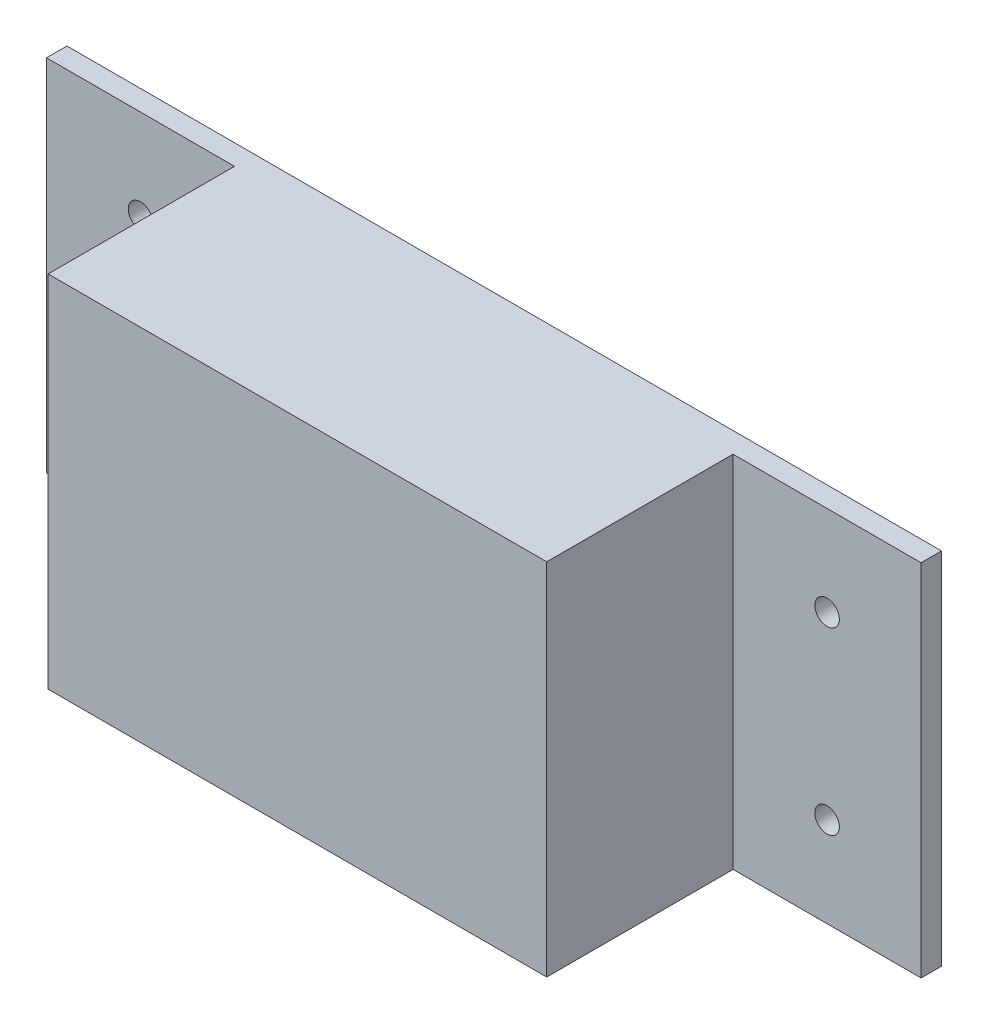
ISO-10303-21;
HEADER;
FILE_DESCRIPTION(('STEP AP214'),'2;1');
FILE_NAME('part.step','',(''),(''),'','','');
FILE_SCHEMA(('AUTOMOTIVE_DESIGN { 1 0 10303 214 1 1 1 1 }'));
ENDSEC;
DATA;
#1=APPLICATION_CONTEXT('core data for automotive mechanical design processes');
#2=APPLICATION_PROTOCOL_DEFINITION('international standard','automotive_design',2000,#1);
#3=PRODUCT_CONTEXT('',#1,'mechanical');
#4=PRODUCT('Part','Part','',(#3));
#5=PRODUCT_RELATED_PRODUCT_CATEGORY('part','',(#4));
#6=PRODUCT_DEFINITION_FORMATION('','',#4);
#7=PRODUCT_DEFINITION_CONTEXT('part definition',#1,'design');
#8=PRODUCT_DEFINITION('design','',#6,#7);
#9=PRODUCT_DEFINITION_SHAPE('','',#8);
#10=(LENGTH_UNIT() NAMED_UNIT(*) SI_UNIT(.MILLI.,.METRE.));
#11=(NAMED_UNIT(*) PLANE_ANGLE_UNIT() SI_UNIT($,.RADIAN.));
#12=(NAMED_UNIT(*) SI_UNIT($,.STERADIAN.) SOLID_ANGLE_UNIT());
#13=UNCERTAINTY_MEASURE_WITH_UNIT(LENGTH_MEASURE(1.E-05),#10,'distance_accuracy_value','');
#14=(GEOMETRIC_REPRESENTATION_CONTEXT(3) GLOBAL_UNCERTAINTY_ASSIGNED_CONTEXT((#13)) GLOBAL_UNIT_ASSIGNED_CONTEXT((#10,
#11,#12)) REPRESENTATION_CONTEXT('',''));
#15=CARTESIAN_POINT('',(0.,0.,0.));
#16=DIRECTION('',(0.,0.,1.));
#17=DIRECTION('',(1.,0.,0.));
#18=AXIS2_PLACEMENT_3D('',#15,#16,#17);
#19=CARTESIAN_POINT('',(0.,0.,0.));
#20=DIRECTION('',(0.,0.,-1.));
#21=DIRECTION('',(-1.,0.,0.));
#22=AXIS2_PLACEMENT_3D('',#19,#20,#21);
#23=PLANE('',#22);
#24=CARTESIAN_POINT('',(42.,-11.,0.));
#25=DIRECTION('',(0.,0.,-1.));
#26=DIRECTION('',(-1.,0.,0.));
#27=AXIS2_PLACEMENT_3D('',#24,#25,#26);
#28=CIRCLE('',#27,1.5);
#29=CARTESIAN_POINT('',(40.5,-11.,0.));
#30=VERTEX_POINT('',#29);
#31=EDGE_CURVE('E532',#30,#30,#28,.F.);
#32=ORIENTED_EDGE('',*,*,#31,.T.);
#33=EDGE_LOOP('',(#32));
#34=FACE_BOUND('',#33,.T.);
#35=CARTESIAN_POINT('',(-42.,11.,0.));
#36=DIRECTION('',(0.,0.,-1.));
#37=DIRECTION('',(-1.,0.,0.));
#38=AXIS2_PLACEMENT_3D('',#35,#36,#37);
#39=CIRCLE('',#38,1.5);
#40=CARTESIAN_POINT('',(-43.5,11.,0.));
#41=VERTEX_POINT('',#40);
#42=EDGE_CURVE('E544',#41,#41,#39,.F.);
#43=ORIENTED_EDGE('',*,*,#42,.T.);
#44=EDGE_LOOP('',(#43));
#45=FACE_BOUND('',#44,.T.);
#46=DIRECTION('',(0.,-1.,0.));
#47=VECTOR('',#46,1.);
#48=CARTESIAN_POINT('',(27.5,0.,0.));
#49=LINE('',#48,#47);
#50=CARTESIAN_POINT('',(27.5,19.,0.));
#51=VERTEX_POINT('',#50);
#52=CARTESIAN_POINT('',(27.5,-19.,0.));
#53=VERTEX_POINT('',#52);
#54=EDGE_CURVE('E237',#51,#53,#49,.T.);
#55=ORIENTED_EDGE('',*,*,#54,.F.);
#56=DIRECTION('',(1.,0.,0.));
#57=VECTOR('',#56,1.);
#58=CARTESIAN_POINT('',(0.,19.,0.));
#59=LINE('',#58,#57);
#60=CARTESIAN_POINT('',(-27.5,19.,0.));
#61=VERTEX_POINT('',#60);
#62=EDGE_CURVE('E256',#61,#51,#59,.T.);
#63=ORIENTED_EDGE('',*,*,#62,.F.);
#64=DIRECTION('',(0.,-1.,0.));
#65=VECTOR('',#64,1.);
#66=CARTESIAN_POINT('',(-27.5,0.,0.));
#67=LINE('',#66,#65);
#68=CARTESIAN_POINT('',(-27.5,-19.,0.));
#69=VERTEX_POINT('',#68);
#70=EDGE_CURVE('E260',#61,#69,#67,.T.);
#71=ORIENTED_EDGE('',*,*,#70,.T.);
#72=DIRECTION('',(1.,0.,0.));
#73=VECTOR('',#72,1.);
#74=CARTESIAN_POINT('',(0.,-19.,0.));
#75=LINE('',#74,#73);
#76=EDGE_CURVE('E242',#69,#53,#75,.T.);
#77=ORIENTED_EDGE('',*,*,#76,.T.);
#78=EDGE_LOOP('',(#55,#63,#71,#77));
#79=FACE_BOUND('',#78,.T.);
#80=DIRECTION('',(1.,0.,0.));
#81=VECTOR('',#80,1.);
#82=CARTESIAN_POINT('',(-30.5,22.,0.));
#83=LINE('',#82,#81);
#84=CARTESIAN_POINT('',(-53.5,22.,0.));
#85=VERTEX_POINT('',#84);
#86=CARTESIAN_POINT('',(53.5,22.,0.));
#87=VERTEX_POINT('',#86);
#88=EDGE_CURVE('E157',#85,#87,#83,.T.);
#89=ORIENTED_EDGE('',*,*,#88,.T.);
#90=DIRECTION('',(0.,1.,0.));
#91=VECTOR('',#90,1.);
#92=CARTESIAN_POINT('',(53.5,22.,0.));
#93=LINE('',#92,#91);
#94=CARTESIAN_POINT('',(53.5,-22.,0.));
#95=VERTEX_POINT('',#94);
#96=EDGE_CURVE('E161',#95,#87,#93,.T.);
#97=ORIENTED_EDGE('',*,*,#96,.F.);
#98=DIRECTION('',(1.,0.,0.));
#99=VECTOR('',#98,1.);
#100=CARTESIAN_POINT('',(-30.5,-22.,0.));
#101=LINE('',#100,#99);
#102=CARTESIAN_POINT('',(-53.5,-22.,0.));
#103=VERTEX_POINT('',#102);
#104=EDGE_CURVE('E168',#103,#95,#101,.T.);
#105=ORIENTED_EDGE('',*,*,#104,.F.);
#106=DIRECTION('',(0.,-1.,0.));
#107=VECTOR('',#106,1.);
#108=CARTESIAN_POINT('',(-53.5,22.,0.));
#109=LINE('',#108,#107);
#110=EDGE_CURVE('E163',#85,#103,#109,.T.);
#111=ORIENTED_EDGE('',*,*,#110,.F.);
#112=EDGE_LOOP('',(#89,#97,#105,#111));
#113=FACE_BOUND('',#112,.T.);
#114=CARTESIAN_POINT('',(42.,11.,0.));
#115=DIRECTION('',(0.,0.,-1.));
#116=DIRECTION('',(-1.,0.,0.));
#117=AXIS2_PLACEMENT_3D('',#114,#115,#116);
#118=CIRCLE('',#117,1.5);
#119=CARTESIAN_POINT('',(40.5,11.,0.));
#120=VERTEX_POINT('',#119);
#121=EDGE_CURVE('E541',#120,#120,#118,.T.);
#122=ORIENTED_EDGE('',*,*,#121,.F.);
#123=EDGE_LOOP('',(#122));
#124=FACE_BOUND('',#123,.T.);
#125=CARTESIAN_POINT('',(-42.,-11.,0.));
#126=DIRECTION('',(0.,0.,-1.));
#127=DIRECTION('',(-1.,0.,0.));
#128=AXIS2_PLACEMENT_3D('',#125,#126,#127);
#129=CIRCLE('',#128,1.5);
#130=CARTESIAN_POINT('',(-43.5,-11.,0.));
#131=VERTEX_POINT('',#130);
#132=EDGE_CURVE('E187',#131,#131,#129,.T.);
#133=ORIENTED_EDGE('',*,*,#132,.F.);
#134=EDGE_LOOP('',(#133));
#135=FACE_BOUND('',#134,.T.);
#136=ADVANCED_FACE('F63',(#34,#45,#79,#113,#124,#135),#23,.T.);
#137=CARTESIAN_POINT('',(-53.5,22.,2.5));
#138=DIRECTION('',(0.,0.,1.));
#139=DIRECTION('',(0.,-1.,0.));
#140=AXIS2_PLACEMENT_3D('',#137,#138,#139);
#141=PLANE('',#140);
#142=CARTESIAN_POINT('',(-42.,11.,2.5));
#143=DIRECTION('',(0.,0.,-1.));
#144=DIRECTION('',(-1.,0.,0.));
#145=AXIS2_PLACEMENT_3D('',#142,#143,#144);
#146=CIRCLE('',#145,1.5);
#147=CARTESIAN_POINT('',(-43.5,11.,2.5));
#148=VERTEX_POINT('',#147);
#149=EDGE_CURVE('E526',#148,#148,#146,.T.);
#150=ORIENTED_EDGE('',*,*,#149,.T.);
#151=EDGE_LOOP('',(#150));
#152=FACE_BOUND('',#151,.T.);
#153=DIRECTION('',(0.,-1.,0.));
#154=VECTOR('',#153,1.);
#155=CARTESIAN_POINT('',(-30.5,22.,2.5));
#156=LINE('',#155,#154);
#157=CARTESIAN_POINT('',(-30.5,22.,2.5));
#158=VERTEX_POINT('',#157);
#159=CARTESIAN_POINT('',(-30.5,-22.,2.5));
#160=VERTEX_POINT('',#159);
#161=EDGE_CURVE('E202',#158,#160,#156,.T.);
#162=ORIENTED_EDGE('',*,*,#161,.F.);
#163=DIRECTION('',(1.,0.,0.));
#164=VECTOR('',#163,1.);
#165=CARTESIAN_POINT('',(-53.5,22.,2.5));
#166=LINE('',#165,#164);
#167=CARTESIAN_POINT('',(-53.5,22.,2.5));
#168=VERTEX_POINT('',#167);
#169=EDGE_CURVE('E214',#168,#158,#166,.T.);
#170=ORIENTED_EDGE('',*,*,#169,.F.);
#171=DIRECTION('',(0.,-1.,0.));
#172=VECTOR('',#171,1.);
#173=CARTESIAN_POINT('',(-53.5,22.,2.5));
#174=LINE('',#173,#172);
#175=CARTESIAN_POINT('',(-53.5,-22.,2.5));
#176=VERTEX_POINT('',#175);
#177=EDGE_CURVE('E206',#168,#176,#174,.T.);
#178=ORIENTED_EDGE('',*,*,#177,.T.);
#179=DIRECTION('',(1.,0.,0.));
#180=VECTOR('',#179,1.);
#181=CARTESIAN_POINT('',(-53.5,-22.,2.5));
#182=LINE('',#181,#180);
#183=EDGE_CURVE('E89',#176,#160,#182,.T.);
#184=ORIENTED_EDGE('',*,*,#183,.T.);
#185=EDGE_LOOP('',(#162,#170,#178,#184));
#186=FACE_BOUND('',#185,.T.);
#187=CARTESIAN_POINT('',(-42.,-11.,2.5));
#188=DIRECTION('',(0.,0.,1.));
#189=DIRECTION('',(1.,0.,0.));
#190=AXIS2_PLACEMENT_3D('',#187,#188,#189);
#191=CIRCLE('',#190,1.5);
#192=CARTESIAN_POINT('',(-40.5,-11.,2.5));
#193=VERTEX_POINT('',#192);
#194=EDGE_CURVE('E524',#193,#193,#191,.T.);
#195=ORIENTED_EDGE('',*,*,#194,.F.);
#196=EDGE_LOOP('',(#195));
#197=FACE_BOUND('',#196,.T.);
#198=ADVANCED_FACE('F297',(#152,#186,#197),#141,.T.);
#199=CARTESIAN_POINT('',(53.5,22.,2.5));
#200=DIRECTION('',(0.,0.,-1.));
#201=DIRECTION('',(0.,1.,0.));
#202=AXIS2_PLACEMENT_3D('',#199,#200,#201);
#203=PLANE('',#202);
#204=DIRECTION('',(0.,-1.,0.));
#205=VECTOR('',#204,1.);
#206=CARTESIAN_POINT('',(30.5,22.,2.5));
#207=LINE('',#206,#205);
#208=CARTESIAN_POINT('',(30.5,22.,2.5));
#209=VERTEX_POINT('',#208);
#210=CARTESIAN_POINT('',(30.5,-22.,2.49999999999999));
#211=VERTEX_POINT('',#210);
#212=EDGE_CURVE('E81',#209,#211,#207,.T.);
#213=ORIENTED_EDGE('',*,*,#212,.T.);
#214=DIRECTION('',(-1.,0.,0.));
#215=VECTOR('',#214,1.);
#216=CARTESIAN_POINT('',(53.5,-22.,2.49999999999999));
#217=LINE('',#216,#215);
#218=CARTESIAN_POINT('',(53.5,-22.,2.49999999999999));
#219=VERTEX_POINT('',#218);
#220=EDGE_CURVE('E195',#219,#211,#217,.T.);
#221=ORIENTED_EDGE('',*,*,#220,.F.);
#222=DIRECTION('',(0.,-1.,0.));
#223=VECTOR('',#222,1.);
#224=CARTESIAN_POINT('',(53.5,22.,2.5));
#225=LINE('',#224,#223);
#226=CARTESIAN_POINT('',(53.5,22.,2.5));
#227=VERTEX_POINT('',#226);
#228=EDGE_CURVE('E178',#227,#219,#225,.T.);
#229=ORIENTED_EDGE('',*,*,#228,.F.);
#230=DIRECTION('',(-1.,0.,0.));
#231=VECTOR('',#230,1.);
#232=CARTESIAN_POINT('',(53.5,22.,2.5));
#233=LINE('',#232,#231);
#234=EDGE_CURVE('E174',#227,#209,#233,.T.);
#235=ORIENTED_EDGE('',*,*,#234,.T.);
#236=EDGE_LOOP('',(#213,#221,#229,#235));
#237=FACE_BOUND('',#236,.T.);
#238=CARTESIAN_POINT('',(42.,-11.,2.5));
#239=DIRECTION('',(0.,0.,-1.));
#240=DIRECTION('',(-1.,0.,0.));
#241=AXIS2_PLACEMENT_3D('',#238,#239,#240);
#242=CIRCLE('',#241,1.5);
#243=CARTESIAN_POINT('',(40.5,-11.,2.5));
#244=VERTEX_POINT('',#243);
#245=EDGE_CURVE('E535',#244,#244,#242,.T.);
#246=ORIENTED_EDGE('',*,*,#245,.T.);
#247=EDGE_LOOP('',(#246));
#248=FACE_BOUND('',#247,.T.);
#249=CARTESIAN_POINT('',(42.,11.,2.5));
#250=DIRECTION('',(0.,0.,1.));
#251=DIRECTION('',(1.,0.,0.));
#252=AXIS2_PLACEMENT_3D('',#249,#250,#251);
#253=CIRCLE('',#252,1.5);
#254=CARTESIAN_POINT('',(43.5,11.,2.5));
#255=VERTEX_POINT('',#254);
#256=EDGE_CURVE('E527',#255,#255,#253,.T.);
#257=ORIENTED_EDGE('',*,*,#256,.F.);
#258=EDGE_LOOP('',(#257));
#259=FACE_BOUND('',#258,.T.);
#260=ADVANCED_FACE('F288',(#237,#248,#259),#203,.F.);
#261=CARTESIAN_POINT('',(-30.5,22.,23.));
#262=DIRECTION('',(0.,1.,0.));
#263=DIRECTION('',(0.,0.,1.));
#264=AXIS2_PLACEMENT_3D('',#261,#262,#263);
#265=PLANE('',#264);
#266=ORIENTED_EDGE('',*,*,#88,.F.);
#267=DIRECTION('',(0.,0.,1.));
#268=VECTOR('',#267,1.);
#269=CARTESIAN_POINT('',(-53.5,22.,0.));
#270=LINE('',#269,#268);
#271=EDGE_CURVE('E209',#85,#168,#270,.T.);
#272=ORIENTED_EDGE('',*,*,#271,.T.);
#273=ORIENTED_EDGE('',*,*,#169,.T.);
#274=DIRECTION('',(0.,0.,-1.));
#275=VECTOR('',#274,1.);
#276=CARTESIAN_POINT('',(-30.5,22.,23.));
#277=LINE('',#276,#275);
#278=CARTESIAN_POINT('',(-30.5,22.,25.3));
#279=VERTEX_POINT('',#278);
#280=EDGE_CURVE('E12',#279,#158,#277,.T.);
#281=ORIENTED_EDGE('',*,*,#280,.F.);
#282=DIRECTION('',(-1.,0.,0.));
#283=VECTOR('',#282,1.);
#284=CARTESIAN_POINT('',(-30.5,22.,25.3));
#285=LINE('',#284,#283);
#286=CARTESIAN_POINT('',(30.5,22.,25.3));
#287=VERTEX_POINT('',#286);
#288=EDGE_CURVE('E233',#287,#279,#285,.T.);
#289=ORIENTED_EDGE('',*,*,#288,.F.);
#290=DIRECTION('',(0.,0.,-1.));
#291=VECTOR('',#290,1.);
#292=CARTESIAN_POINT('',(30.5,22.,23.));
#293=LINE('',#292,#291);
#294=EDGE_CURVE('E67',#287,#209,#293,.T.);
#295=ORIENTED_EDGE('',*,*,#294,.T.);
#296=ORIENTED_EDGE('',*,*,#234,.F.);
#297=DIRECTION('',(0.,0.,1.));
#298=VECTOR('',#297,1.);
#299=CARTESIAN_POINT('',(53.5,22.,0.));
#300=LINE('',#299,#298);
#301=EDGE_CURVE('E172',#87,#227,#300,.T.);
#302=ORIENTED_EDGE('',*,*,#301,.F.);
#303=EDGE_LOOP('',(#266,#272,#273,#281,#289,#295,#296,#302));
#304=FACE_BOUND('',#303,.T.);
#305=ADVANCED_FACE('F65',(#304),#265,.T.);
#306=CARTESIAN_POINT('',(-30.5,22.,23.));
#307=DIRECTION('',(1.,0.,0.));
#308=DIRECTION('',(0.,1.,0.));
#309=AXIS2_PLACEMENT_3D('',#306,#307,#308);
#310=PLANE('',#309);
#311=ORIENTED_EDGE('',*,*,#280,.T.);
#312=ORIENTED_EDGE('',*,*,#161,.T.);
#313=DIRECTION('',(0.,0.,-1.));
#314=VECTOR('',#313,1.);
#315=CARTESIAN_POINT('',(-30.5,-22.,23.));
#316=LINE('',#315,#314);
#317=CARTESIAN_POINT('',(-30.5,-22.,25.3));
#318=VERTEX_POINT('',#317);
#319=EDGE_CURVE('E73',#318,#160,#316,.T.);
#320=ORIENTED_EDGE('',*,*,#319,.F.);
#321=DIRECTION('',(0.,-1.,0.));
#322=VECTOR('',#321,1.);
#323=CARTESIAN_POINT('',(-30.5,22.,25.3));
#324=LINE('',#323,#322);
#325=EDGE_CURVE('E221',#279,#318,#324,.T.);
#326=ORIENTED_EDGE('',*,*,#325,.F.);
#327=EDGE_LOOP('',(#311,#312,#320,#326));
#328=FACE_BOUND('',#327,.T.);
#329=ADVANCED_FACE('F301',(#328),#310,.F.);
#330=CARTESIAN_POINT('',(-30.5,-22.,23.));
#331=DIRECTION('',(0.,1.,0.));
#332=DIRECTION('',(0.,0.,1.));
#333=AXIS2_PLACEMENT_3D('',#330,#331,#332);
#334=PLANE('',#333);
#335=ORIENTED_EDGE('',*,*,#104,.T.);
#336=DIRECTION('',(0.,0.,-1.));
#337=VECTOR('',#336,1.);
#338=CARTESIAN_POINT('',(53.5,-22.,0.));
#339=LINE('',#338,#337);
#340=EDGE_CURVE('E183',#219,#95,#339,.T.);
#341=ORIENTED_EDGE('',*,*,#340,.F.);
#342=ORIENTED_EDGE('',*,*,#220,.T.);
#343=DIRECTION('',(0.,0.,-1.));
#344=VECTOR('',#343,1.);
#345=CARTESIAN_POINT('',(30.5,-22.,23.));
#346=LINE('',#345,#344);
#347=CARTESIAN_POINT('',(30.5,-22.,25.3));
#348=VERTEX_POINT('',#347);
#349=EDGE_CURVE('E282',#348,#211,#346,.T.);
#350=ORIENTED_EDGE('',*,*,#349,.F.);
#351=DIRECTION('',(1.,0.,0.));
#352=VECTOR('',#351,1.);
#353=CARTESIAN_POINT('',(-30.5,-22.,25.3));
#354=LINE('',#353,#352);
#355=EDGE_CURVE('E225',#318,#348,#354,.T.);
#356=ORIENTED_EDGE('',*,*,#355,.F.);
#357=ORIENTED_EDGE('',*,*,#319,.T.);
#358=ORIENTED_EDGE('',*,*,#183,.F.);
#359=DIRECTION('',(0.,0.,1.));
#360=VECTOR('',#359,1.);
#361=CARTESIAN_POINT('',(-53.5,-22.,0.));
#362=LINE('',#361,#360);
#363=EDGE_CURVE('E203',#103,#176,#362,.T.);
#364=ORIENTED_EDGE('',*,*,#363,.F.);
#365=EDGE_LOOP('',(#335,#341,#342,#350,#356,#357,#358,#364));
#366=FACE_BOUND('',#365,.T.);
#367=ADVANCED_FACE('F292',(#366),#334,.F.);
#368=CARTESIAN_POINT('',(30.5,22.,23.));
#369=DIRECTION('',(1.,0.,0.));
#370=DIRECTION('',(0.,1.,0.));
#371=AXIS2_PLACEMENT_3D('',#368,#369,#370);
#372=PLANE('',#371);
#373=ORIENTED_EDGE('',*,*,#212,.F.);
#374=ORIENTED_EDGE('',*,*,#294,.F.);
#375=DIRECTION('',(0.,1.,0.));
#376=VECTOR('',#375,1.);
#377=CARTESIAN_POINT('',(30.5,22.,25.3));
#378=LINE('',#377,#376);
#379=EDGE_CURVE('E229',#348,#287,#378,.T.);
#380=ORIENTED_EDGE('',*,*,#379,.F.);
#381=ORIENTED_EDGE('',*,*,#349,.T.);
#382=EDGE_LOOP('',(#373,#374,#380,#381));
#383=FACE_BOUND('',#382,.T.);
#384=ADVANCED_FACE('F305',(#383),#372,.T.);
#385=CARTESIAN_POINT('',(27.5,0.,23.));
#386=DIRECTION('',(1.,0.,0.));
#387=DIRECTION('',(0.,1.,0.));
#388=AXIS2_PLACEMENT_3D('',#385,#386,#387);
#389=PLANE('',#388);
#390=ORIENTED_EDGE('',*,*,#54,.T.);
#391=DIRECTION('',(0.,0.,-1.));
#392=VECTOR('',#391,1.);
#393=CARTESIAN_POINT('',(27.5,-19.,23.));
#394=LINE('',#393,#392);
#395=CARTESIAN_POINT('',(27.5,-19.,23.));
#396=VERTEX_POINT('',#395);
#397=EDGE_CURVE('E253',#396,#53,#394,.T.);
#398=ORIENTED_EDGE('',*,*,#397,.F.);
#399=DIRECTION('',(0.,-1.,0.));
#400=VECTOR('',#399,1.);
#401=CARTESIAN_POINT('',(27.5,0.,23.));
#402=LINE('',#401,#400);
#403=CARTESIAN_POINT('',(27.5,19.,23.));
#404=VERTEX_POINT('',#403);
#405=EDGE_CURVE('E238',#404,#396,#402,.T.);
#406=ORIENTED_EDGE('',*,*,#405,.F.);
#407=DIRECTION('',(0.,0.,-1.));
#408=VECTOR('',#407,1.);
#409=CARTESIAN_POINT('',(27.5,19.,23.));
#410=LINE('',#409,#408);
#411=EDGE_CURVE('E169',#404,#51,#410,.T.);
#412=ORIENTED_EDGE('',*,*,#411,.T.);
#413=EDGE_LOOP('',(#390,#398,#406,#412));
#414=FACE_BOUND('',#413,.T.);
#415=ADVANCED_FACE('F307',(#414),#389,.F.);
#416=CARTESIAN_POINT('',(0.,19.,23.));
#417=DIRECTION('',(0.,1.,0.));
#418=DIRECTION('',(0.,0.,1.));
#419=AXIS2_PLACEMENT_3D('',#416,#417,#418);
#420=PLANE('',#419);
#421=ORIENTED_EDGE('',*,*,#62,.T.);
#422=ORIENTED_EDGE('',*,*,#411,.F.);
#423=DIRECTION('',(1.,0.,0.));
#424=VECTOR('',#423,1.);
#425=CARTESIAN_POINT('',(0.,19.,23.));
#426=LINE('',#425,#424);
#427=CARTESIAN_POINT('',(-27.5,19.,23.));
#428=VERTEX_POINT('',#427);
#429=EDGE_CURVE('E241',#428,#404,#426,.T.);
#430=ORIENTED_EDGE('',*,*,#429,.F.);
#431=DIRECTION('',(0.,0.,-1.));
#432=VECTOR('',#431,1.);
#433=CARTESIAN_POINT('',(-27.5,19.,23.));
#434=LINE('',#433,#432);
#435=EDGE_CURVE('E273',#428,#61,#434,.T.);
#436=ORIENTED_EDGE('',*,*,#435,.T.);
#437=EDGE_LOOP('',(#421,#422,#430,#436));
#438=FACE_BOUND('',#437,.T.);
#439=ADVANCED_FACE('F312',(#438),#420,.F.);
#440=CARTESIAN_POINT('',(-27.5,0.,23.));
#441=DIRECTION('',(1.,0.,0.));
#442=DIRECTION('',(0.,0.,-1.));
#443=AXIS2_PLACEMENT_3D('',#440,#441,#442);
#444=PLANE('',#443);
#445=ORIENTED_EDGE('',*,*,#70,.F.);
#446=ORIENTED_EDGE('',*,*,#435,.F.);
#447=DIRECTION('',(0.,-1.,0.));
#448=VECTOR('',#447,1.);
#449=CARTESIAN_POINT('',(-27.5,0.,23.));
#450=LINE('',#449,#448);
#451=CARTESIAN_POINT('',(-27.5,-19.,23.));
#452=VERTEX_POINT('',#451);
#453=EDGE_CURVE('E245',#428,#452,#450,.T.);
#454=ORIENTED_EDGE('',*,*,#453,.T.);
#455=DIRECTION('',(0.,0.,-1.));
#456=VECTOR('',#455,1.);
#457=CARTESIAN_POINT('',(-27.5,-19.,23.));
#458=LINE('',#457,#456);
#459=EDGE_CURVE('E270',#452,#69,#458,.T.);
#460=ORIENTED_EDGE('',*,*,#459,.T.);
#461=EDGE_LOOP('',(#445,#446,#454,#460));
#462=FACE_BOUND('',#461,.T.);
#463=ADVANCED_FACE('F352',(#462),#444,.T.);
#464=CARTESIAN_POINT('',(0.,-19.,23.));
#465=DIRECTION('',(0.,1.,0.));
#466=DIRECTION('',(0.,0.,1.));
#467=AXIS2_PLACEMENT_3D('',#464,#465,#466);
#468=PLANE('',#467);
#469=ORIENTED_EDGE('',*,*,#76,.F.);
#470=ORIENTED_EDGE('',*,*,#459,.F.);
#471=DIRECTION('',(1.,0.,0.));
#472=VECTOR('',#471,1.);
#473=CARTESIAN_POINT('',(0.,-19.,23.));
#474=LINE('',#473,#472);
#475=EDGE_CURVE('E249',#452,#396,#474,.T.);
#476=ORIENTED_EDGE('',*,*,#475,.T.);
#477=ORIENTED_EDGE('',*,*,#397,.T.);
#478=EDGE_LOOP('',(#469,#470,#476,#477));
#479=FACE_BOUND('',#478,.T.);
#480=ADVANCED_FACE('F348',(#479),#468,.T.);
#481=CARTESIAN_POINT('',(0.,0.,23.));
#482=DIRECTION('',(0.,0.,1.));
#483=DIRECTION('',(1.,0.,0.));
#484=AXIS2_PLACEMENT_3D('',#481,#482,#483);
#485=PLANE('',#484);
#486=ORIENTED_EDGE('',*,*,#453,.F.);
#487=ORIENTED_EDGE('',*,*,#429,.T.);
#488=ORIENTED_EDGE('',*,*,#405,.T.);
#489=ORIENTED_EDGE('',*,*,#475,.F.);
#490=EDGE_LOOP('',(#486,#487,#488,#489));
#491=FACE_BOUND('',#490,.T.);
#492=ADVANCED_FACE('F345',(#491),#485,.F.);
#493=CARTESIAN_POINT('',(0.,0.,25.3));
#494=DIRECTION('',(0.,0.,1.));
#495=DIRECTION('',(1.,0.,0.));
#496=AXIS2_PLACEMENT_3D('',#493,#494,#495);
#497=PLANE('',#496);
#498=ORIENTED_EDGE('',*,*,#325,.T.);
#499=ORIENTED_EDGE('',*,*,#355,.T.);
#500=ORIENTED_EDGE('',*,*,#379,.T.);
#501=ORIENTED_EDGE('',*,*,#288,.T.);
#502=EDGE_LOOP('',(#498,#499,#500,#501));
#503=FACE_BOUND('',#502,.T.);
#504=ADVANCED_FACE('F304',(#503),#497,.T.);
#505=CARTESIAN_POINT('',(-53.5,0.,0.));
#506=DIRECTION('',(1.,0.,0.));
#507=DIRECTION('',(0.,0.,-1.));
#508=AXIS2_PLACEMENT_3D('',#505,#506,#507);
#509=PLANE('',#508);
#510=ORIENTED_EDGE('',*,*,#363,.T.);
#511=ORIENTED_EDGE('',*,*,#177,.F.);
#512=ORIENTED_EDGE('',*,*,#271,.F.);
#513=ORIENTED_EDGE('',*,*,#110,.T.);
#514=EDGE_LOOP('',(#510,#511,#512,#513));
#515=FACE_BOUND('',#514,.T.);
#516=ADVANCED_FACE('F295',(#515),#509,.F.);
#517=CARTESIAN_POINT('',(53.5,0.,0.));
#518=DIRECTION('',(-1.,0.,0.));
#519=DIRECTION('',(0.,-1.,0.));
#520=AXIS2_PLACEMENT_3D('',#517,#518,#519);
#521=PLANE('',#520);
#522=ORIENTED_EDGE('',*,*,#96,.T.);
#523=ORIENTED_EDGE('',*,*,#301,.T.);
#524=ORIENTED_EDGE('',*,*,#228,.T.);
#525=ORIENTED_EDGE('',*,*,#340,.T.);
#526=EDGE_LOOP('',(#522,#523,#524,#525));
#527=FACE_BOUND('',#526,.T.);
#528=ADVANCED_FACE('F181',(#527),#521,.F.);
#529=CARTESIAN_POINT('',(42.,-11.,-20.5));
#530=DIRECTION('',(0.,0.,1.));
#531=DIRECTION('',(1.,0.,0.));
#532=AXIS2_PLACEMENT_3D('',#529,#530,#531);
#533=CYLINDRICAL_SURFACE('',#532,1.5);
#534=ORIENTED_EDGE('',*,*,#31,.F.);
#535=EDGE_LOOP('',(#534));
#536=FACE_BOUND('',#535,.T.);
#537=ORIENTED_EDGE('',*,*,#245,.F.);
#538=EDGE_LOOP('',(#537));
#539=FACE_BOUND('',#538,.T.);
#540=ADVANCED_FACE('F399',(#536,#539),#533,.F.);
#541=CARTESIAN_POINT('',(42.,11.,-20.5));
#542=DIRECTION('',(0.,0.,1.));
#543=DIRECTION('',(1.,0.,0.));
#544=AXIS2_PLACEMENT_3D('',#541,#542,#543);
#545=CYLINDRICAL_SURFACE('',#544,1.5);
#546=ORIENTED_EDGE('',*,*,#121,.T.);
#547=EDGE_LOOP('',(#546));
#548=FACE_BOUND('',#547,.T.);
#549=ORIENTED_EDGE('',*,*,#256,.T.);
#550=EDGE_LOOP('',(#549));
#551=FACE_BOUND('',#550,.T.);
#552=ADVANCED_FACE('F405',(#548,#551),#545,.F.);
#553=CARTESIAN_POINT('',(-42.,11.,-20.5));
#554=DIRECTION('',(0.,0.,1.));
#555=DIRECTION('',(1.,0.,0.));
#556=AXIS2_PLACEMENT_3D('',#553,#554,#555);
#557=CYLINDRICAL_SURFACE('',#556,1.5);
#558=ORIENTED_EDGE('',*,*,#42,.F.);
#559=EDGE_LOOP('',(#558));
#560=FACE_BOUND('',#559,.T.);
#561=ORIENTED_EDGE('',*,*,#149,.F.);
#562=EDGE_LOOP('',(#561));
#563=FACE_BOUND('',#562,.T.);
#564=ADVANCED_FACE('F413',(#560,#563),#557,.F.);
#565=CARTESIAN_POINT('',(-42.,-11.,-20.5));
#566=DIRECTION('',(0.,0.,1.));
#567=DIRECTION('',(1.,0.,0.));
#568=AXIS2_PLACEMENT_3D('',#565,#566,#567);
#569=CYLINDRICAL_SURFACE('',#568,1.5);
#570=ORIENTED_EDGE('',*,*,#132,.T.);
#571=EDGE_LOOP('',(#570));
#572=FACE_BOUND('',#571,.T.);
#573=ORIENTED_EDGE('',*,*,#194,.T.);
#574=EDGE_LOOP('',(#573));
#575=FACE_BOUND('',#574,.T.);
#576=ADVANCED_FACE('F421',(#572,#575),#569,.F.);
#577=CLOSED_SHELL('',(#136,#198,#260,#305,#329,#367,#384,#415,#439,#463,#480,#492,#504,#516,
#528,#540,#552,#564,#576));
#578=MANIFOLD_SOLID_BREP('B2',#577);
#579=ADVANCED_BREP_SHAPE_REPRESENTATION('',(#18,#578),#14);
#580=SHAPE_DEFINITION_REPRESENTATION(#9,#579);
ENDSEC;
END-ISO-10303-21;
